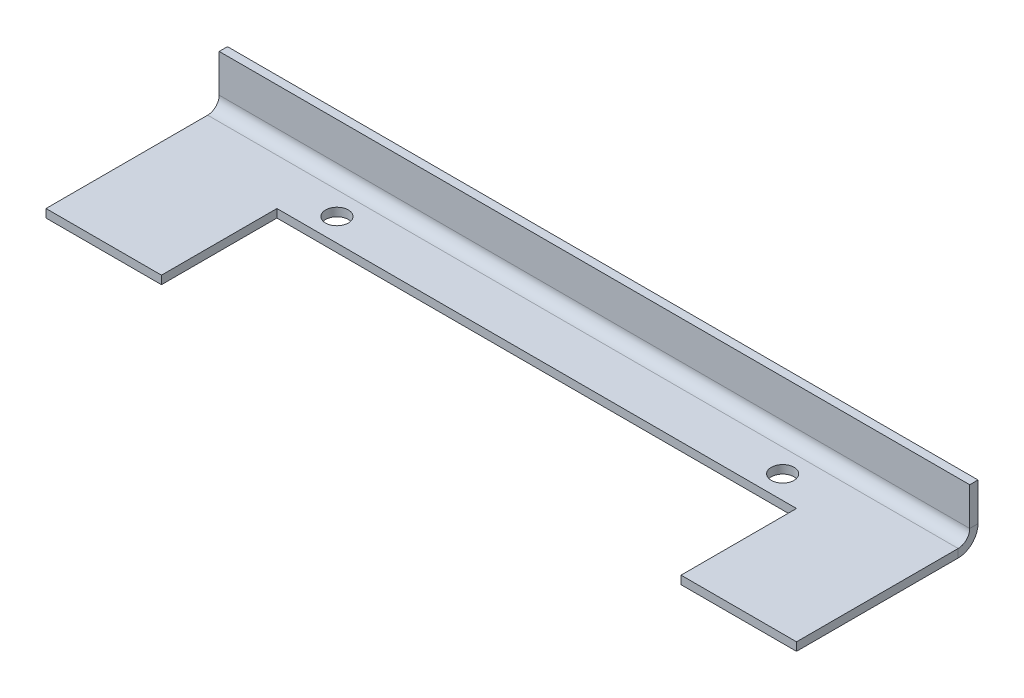
ISO-10303-21;
HEADER;
FILE_DESCRIPTION(('STEP AP214'),'2;1');
FILE_NAME('part.step','',(''),(''),'','','');
FILE_SCHEMA(('AUTOMOTIVE_DESIGN { 1 0 10303 214 1 1 1 1 }'));
ENDSEC;
DATA;
#1=APPLICATION_CONTEXT('core data for automotive mechanical design processes');
#2=APPLICATION_PROTOCOL_DEFINITION('international standard','automotive_design',2000,#1);
#3=PRODUCT_CONTEXT('',#1,'mechanical');
#4=PRODUCT('Part','Part','',(#3));
#5=PRODUCT_RELATED_PRODUCT_CATEGORY('part','',(#4));
#6=PRODUCT_DEFINITION_FORMATION('','',#4);
#7=PRODUCT_DEFINITION_CONTEXT('part definition',#1,'design');
#8=PRODUCT_DEFINITION('design','',#6,#7);
#9=PRODUCT_DEFINITION_SHAPE('','',#8);
#10=(LENGTH_UNIT() NAMED_UNIT(*) SI_UNIT(.MILLI.,.METRE.));
#11=(NAMED_UNIT(*) PLANE_ANGLE_UNIT() SI_UNIT($,.RADIAN.));
#12=(NAMED_UNIT(*) SI_UNIT($,.STERADIAN.) SOLID_ANGLE_UNIT());
#13=UNCERTAINTY_MEASURE_WITH_UNIT(LENGTH_MEASURE(1.E-05),#10,'distance_accuracy_value','');
#14=(GEOMETRIC_REPRESENTATION_CONTEXT(3) GLOBAL_UNCERTAINTY_ASSIGNED_CONTEXT((#13)) GLOBAL_UNIT_ASSIGNED_CONTEXT((#10,
#11,#12)) REPRESENTATION_CONTEXT('',''));
#15=CARTESIAN_POINT('',(0.,0.,0.));
#16=DIRECTION('',(0.,0.,1.));
#17=DIRECTION('',(1.,0.,0.));
#18=AXIS2_PLACEMENT_3D('',#15,#16,#17);
#19=CARTESIAN_POINT('',(0.,-0.91186,0.));
#20=DIRECTION('',(-1.,0.,0.));
#21=DIRECTION('',(0.,0.,1.));
#22=AXIS2_PLACEMENT_3D('',#19,#20,#21);
#23=PLANE('',#22);
#24=DIRECTION('',(0.,0.,1.));
#25=VECTOR('',#24,1.);
#26=CARTESIAN_POINT('',(0.,0.,0.));
#27=LINE('',#26,#25);
#28=CARTESIAN_POINT('',(0.,0.,1.27));
#29=VERTEX_POINT('',#28);
#30=CARTESIAN_POINT('',(0.,0.,19.05));
#31=VERTEX_POINT('',#30);
#32=EDGE_CURVE('E140',#29,#31,#27,.T.);
#33=ORIENTED_EDGE('',*,*,#32,.F.);
#34=DIRECTION('',(0.,-1.,0.));
#35=VECTOR('',#34,1.);
#36=CARTESIAN_POINT('',(0.,0.,1.27));
#37=LINE('',#36,#35);
#38=CARTESIAN_POINT('',(0.,-0.911860000000013,1.27));
#39=VERTEX_POINT('',#38);
#40=EDGE_CURVE('E191',#29,#39,#37,.T.);
#41=ORIENTED_EDGE('',*,*,#40,.T.);
#42=DIRECTION('',(0.,0.,1.));
#43=VECTOR('',#42,1.);
#44=CARTESIAN_POINT('',(0.,-0.91186,0.));
#45=LINE('',#44,#43);
#46=CARTESIAN_POINT('',(0.,-0.91186,19.05));
#47=VERTEX_POINT('',#46);
#48=EDGE_CURVE('E94',#39,#47,#45,.T.);
#49=ORIENTED_EDGE('',*,*,#48,.T.);
#50=DIRECTION('',(0.,1.,0.));
#51=VECTOR('',#50,1.);
#52=CARTESIAN_POINT('',(0.,-0.91186,19.05));
#53=LINE('',#52,#51);
#54=EDGE_CURVE('E40',#47,#31,#53,.T.);
#55=ORIENTED_EDGE('',*,*,#54,.T.);
#56=EDGE_LOOP('',(#33,#41,#49,#55));
#57=FACE_BOUND('',#56,.T.);
#58=ADVANCED_FACE('F36',(#57),#23,.T.);
#59=CARTESIAN_POINT('',(0.,-0.91186,0.));
#60=DIRECTION('',(0.,-1.,0.));
#61=DIRECTION('',(0.,0.,-1.));
#62=AXIS2_PLACEMENT_3D('',#59,#60,#61);
#63=PLANE('',#62);
#64=CARTESIAN_POINT('',(65.786,-0.91186,3.81));
#65=DIRECTION('',(0.,-1.,0.));
#66=DIRECTION('',(0.,0.,-1.));
#67=AXIS2_PLACEMENT_3D('',#64,#65,#66);
#68=CIRCLE('',#67,1.25);
#69=CARTESIAN_POINT('',(65.786,-0.91186,2.56));
#70=VERTEX_POINT('',#69);
#71=EDGE_CURVE('E190',#70,#70,#68,.T.);
#72=ORIENTED_EDGE('',*,*,#71,.F.);
#73=EDGE_LOOP('',(#72));
#74=FACE_BOUND('',#73,.T.);
#75=CARTESIAN_POINT('',(16.764,-0.91186,3.81));
#76=DIRECTION('',(0.,-1.,0.));
#77=DIRECTION('',(0.,0.,-1.));
#78=AXIS2_PLACEMENT_3D('',#75,#76,#77);
#79=CIRCLE('',#78,1.25);
#80=CARTESIAN_POINT('',(16.764,-0.91186,2.56));
#81=VERTEX_POINT('',#80);
#82=EDGE_CURVE('E198',#81,#81,#79,.T.);
#83=ORIENTED_EDGE('',*,*,#82,.F.);
#84=EDGE_LOOP('',(#83));
#85=FACE_BOUND('',#84,.T.);
#86=ORIENTED_EDGE('',*,*,#48,.F.);
#87=DIRECTION('',(-1.,0.,0.));
#88=VECTOR('',#87,1.);
#89=CARTESIAN_POINT('',(0.,-0.911860000000013,1.27));
#90=LINE('',#89,#88);
#91=CARTESIAN_POINT('',(82.55,-0.91186,1.27));
#92=VERTEX_POINT('',#91);
#93=EDGE_CURVE('E469',#39,#92,#90,.F.);
#94=ORIENTED_EDGE('',*,*,#93,.T.);
#95=DIRECTION('',(0.,0.,-1.));
#96=VECTOR('',#95,1.);
#97=CARTESIAN_POINT('',(82.55,-0.91186,0.));
#98=LINE('',#97,#96);
#99=CARTESIAN_POINT('',(82.55,-0.91186,19.05));
#100=VERTEX_POINT('',#99);
#101=EDGE_CURVE('E154',#100,#92,#98,.T.);
#102=ORIENTED_EDGE('',*,*,#101,.F.);
#103=DIRECTION('',(1.,0.,0.));
#104=VECTOR('',#103,1.);
#105=CARTESIAN_POINT('',(82.55,-0.91186,19.05));
#106=LINE('',#105,#104);
#107=CARTESIAN_POINT('',(69.85,-0.91186,19.05));
#108=VERTEX_POINT('',#107);
#109=EDGE_CURVE('E127',#108,#100,#106,.T.);
#110=ORIENTED_EDGE('',*,*,#109,.F.);
#111=DIRECTION('',(0.,0.,1.));
#112=VECTOR('',#111,1.);
#113=CARTESIAN_POINT('',(69.85,-0.91186,6.35));
#114=LINE('',#113,#112);
#115=CARTESIAN_POINT('',(69.85,-0.91186,6.35));
#116=VERTEX_POINT('',#115);
#117=EDGE_CURVE('E111',#116,#108,#114,.T.);
#118=ORIENTED_EDGE('',*,*,#117,.F.);
#119=DIRECTION('',(1.,0.,0.));
#120=VECTOR('',#119,1.);
#121=CARTESIAN_POINT('',(12.7,-0.91186,6.35));
#122=LINE('',#121,#120);
#123=CARTESIAN_POINT('',(12.7,-0.91186,6.35));
#124=VERTEX_POINT('',#123);
#125=EDGE_CURVE('E125',#124,#116,#122,.T.);
#126=ORIENTED_EDGE('',*,*,#125,.F.);
#127=DIRECTION('',(0.,0.,-1.));
#128=VECTOR('',#127,1.);
#129=CARTESIAN_POINT('',(12.7,-0.91186,6.35));
#130=LINE('',#129,#128);
#131=CARTESIAN_POINT('',(12.7,-0.91186,19.05));
#132=VERTEX_POINT('',#131);
#133=EDGE_CURVE('E130',#132,#124,#130,.T.);
#134=ORIENTED_EDGE('',*,*,#133,.F.);
#135=DIRECTION('',(1.,0.,0.));
#136=VECTOR('',#135,1.);
#137=CARTESIAN_POINT('',(0.,-0.91186,19.05));
#138=LINE('',#137,#136);
#139=EDGE_CURVE('E132',#47,#132,#138,.T.);
#140=ORIENTED_EDGE('',*,*,#139,.F.);
#141=EDGE_LOOP('',(#86,#94,#102,#110,#118,#126,#134,#140));
#142=FACE_BOUND('',#141,.T.);
#143=ADVANCED_FACE('F123',(#74,#85,#142),#63,.T.);
#144=CARTESIAN_POINT('',(0.,0.,0.));
#145=DIRECTION('',(0.,-1.,0.));
#146=DIRECTION('',(0.,0.,-1.));
#147=AXIS2_PLACEMENT_3D('',#144,#145,#146);
#148=PLANE('',#147);
#149=CARTESIAN_POINT('',(16.764,0.,3.81));
#150=DIRECTION('',(0.,-1.,0.));
#151=DIRECTION('',(0.,0.,-1.));
#152=AXIS2_PLACEMENT_3D('',#149,#150,#151);
#153=CIRCLE('',#152,1.25);
#154=CARTESIAN_POINT('',(16.764,0.,2.56));
#155=VERTEX_POINT('',#154);
#156=EDGE_CURVE('E141',#155,#155,#153,.T.);
#157=ORIENTED_EDGE('',*,*,#156,.T.);
#158=EDGE_LOOP('',(#157));
#159=FACE_BOUND('',#158,.T.);
#160=CARTESIAN_POINT('',(65.786,0.,3.81));
#161=DIRECTION('',(0.,-1.,0.));
#162=DIRECTION('',(0.,0.,-1.));
#163=AXIS2_PLACEMENT_3D('',#160,#161,#162);
#164=CIRCLE('',#163,1.25);
#165=CARTESIAN_POINT('',(65.786,0.,2.56));
#166=VERTEX_POINT('',#165);
#167=EDGE_CURVE('E195',#166,#166,#164,.T.);
#168=ORIENTED_EDGE('',*,*,#167,.T.);
#169=EDGE_LOOP('',(#168));
#170=FACE_BOUND('',#169,.T.);
#171=DIRECTION('',(-1.,0.,0.));
#172=VECTOR('',#171,1.);
#173=CARTESIAN_POINT('',(0.,0.,1.27));
#174=LINE('',#173,#172);
#175=CARTESIAN_POINT('',(82.55,0.,1.27));
#176=VERTEX_POINT('',#175);
#177=EDGE_CURVE('E170',#29,#176,#174,.F.);
#178=ORIENTED_EDGE('',*,*,#177,.F.);
#179=ORIENTED_EDGE('',*,*,#32,.T.);
#180=DIRECTION('',(1.,0.,0.));
#181=VECTOR('',#180,1.);
#182=CARTESIAN_POINT('',(0.,0.,19.05));
#183=LINE('',#182,#181);
#184=CARTESIAN_POINT('',(12.7,0.,19.05));
#185=VERTEX_POINT('',#184);
#186=EDGE_CURVE('E143',#31,#185,#183,.T.);
#187=ORIENTED_EDGE('',*,*,#186,.T.);
#188=DIRECTION('',(0.,0.,-1.));
#189=VECTOR('',#188,1.);
#190=CARTESIAN_POINT('',(12.7,0.,6.35));
#191=LINE('',#190,#189);
#192=CARTESIAN_POINT('',(12.7,0.,6.35));
#193=VERTEX_POINT('',#192);
#194=EDGE_CURVE('E146',#185,#193,#191,.T.);
#195=ORIENTED_EDGE('',*,*,#194,.T.);
#196=DIRECTION('',(1.,0.,0.));
#197=VECTOR('',#196,1.);
#198=CARTESIAN_POINT('',(12.7,0.,6.35));
#199=LINE('',#198,#197);
#200=CARTESIAN_POINT('',(69.85,0.,6.35));
#201=VERTEX_POINT('',#200);
#202=EDGE_CURVE('E149',#193,#201,#199,.T.);
#203=ORIENTED_EDGE('',*,*,#202,.T.);
#204=DIRECTION('',(0.,0.,1.));
#205=VECTOR('',#204,1.);
#206=CARTESIAN_POINT('',(69.85,0.,6.35));
#207=LINE('',#206,#205);
#208=CARTESIAN_POINT('',(69.85,0.,19.05));
#209=VERTEX_POINT('',#208);
#210=EDGE_CURVE('E114',#201,#209,#207,.T.);
#211=ORIENTED_EDGE('',*,*,#210,.T.);
#212=DIRECTION('',(1.,0.,0.));
#213=VECTOR('',#212,1.);
#214=CARTESIAN_POINT('',(82.55,0.,19.05));
#215=LINE('',#214,#213);
#216=CARTESIAN_POINT('',(82.55,0.,19.05));
#217=VERTEX_POINT('',#216);
#218=EDGE_CURVE('E152',#209,#217,#215,.T.);
#219=ORIENTED_EDGE('',*,*,#218,.T.);
#220=DIRECTION('',(0.,0.,-1.));
#221=VECTOR('',#220,1.);
#222=CARTESIAN_POINT('',(82.55,0.,0.));
#223=LINE('',#222,#221);
#224=EDGE_CURVE('E137',#217,#176,#223,.T.);
#225=ORIENTED_EDGE('',*,*,#224,.T.);
#226=EDGE_LOOP('',(#178,#179,#187,#195,#203,#211,#219,#225));
#227=FACE_BOUND('',#226,.T.);
#228=ADVANCED_FACE('F168',(#159,#170,#227),#148,.F.);
#229=CARTESIAN_POINT('',(82.55,-0.91186,0.));
#230=DIRECTION('',(1.,0.,0.));
#231=DIRECTION('',(0.,0.,-1.));
#232=AXIS2_PLACEMENT_3D('',#229,#230,#231);
#233=PLANE('',#232);
#234=DIRECTION('',(0.,-1.,0.));
#235=VECTOR('',#234,1.);
#236=CARTESIAN_POINT('',(82.55,0.,1.27));
#237=LINE('',#236,#235);
#238=EDGE_CURVE('E188',#176,#92,#237,.T.);
#239=ORIENTED_EDGE('',*,*,#238,.F.);
#240=ORIENTED_EDGE('',*,*,#224,.F.);
#241=DIRECTION('',(0.,1.,0.));
#242=VECTOR('',#241,1.);
#243=CARTESIAN_POINT('',(82.55,-0.91186,19.05));
#244=LINE('',#243,#242);
#245=EDGE_CURVE('E11',#100,#217,#244,.T.);
#246=ORIENTED_EDGE('',*,*,#245,.F.);
#247=ORIENTED_EDGE('',*,*,#101,.T.);
#248=EDGE_LOOP('',(#239,#240,#246,#247));
#249=FACE_BOUND('',#248,.T.);
#250=ADVANCED_FACE('F38',(#249),#233,.T.);
#251=CARTESIAN_POINT('',(82.55,-0.91186,19.05));
#252=DIRECTION('',(0.,0.,1.));
#253=DIRECTION('',(1.,0.,0.));
#254=AXIS2_PLACEMENT_3D('',#251,#252,#253);
#255=PLANE('',#254);
#256=ORIENTED_EDGE('',*,*,#218,.F.);
#257=DIRECTION('',(0.,1.,0.));
#258=VECTOR('',#257,1.);
#259=CARTESIAN_POINT('',(69.85,-0.91186,19.05));
#260=LINE('',#259,#258);
#261=EDGE_CURVE('E45',#108,#209,#260,.T.);
#262=ORIENTED_EDGE('',*,*,#261,.F.);
#263=ORIENTED_EDGE('',*,*,#109,.T.);
#264=ORIENTED_EDGE('',*,*,#245,.T.);
#265=EDGE_LOOP('',(#256,#262,#263,#264));
#266=FACE_BOUND('',#265,.T.);
#267=ADVANCED_FACE('F207',(#266),#255,.T.);
#268=CARTESIAN_POINT('',(69.85,-0.91186,6.35));
#269=DIRECTION('',(-1.,0.,0.));
#270=DIRECTION('',(0.,0.,1.));
#271=AXIS2_PLACEMENT_3D('',#268,#269,#270);
#272=PLANE('',#271);
#273=ORIENTED_EDGE('',*,*,#210,.F.);
#274=DIRECTION('',(0.,1.,0.));
#275=VECTOR('',#274,1.);
#276=CARTESIAN_POINT('',(69.85,-0.91186,6.35));
#277=LINE('',#276,#275);
#278=EDGE_CURVE('E108',#116,#201,#277,.T.);
#279=ORIENTED_EDGE('',*,*,#278,.F.);
#280=ORIENTED_EDGE('',*,*,#117,.T.);
#281=ORIENTED_EDGE('',*,*,#261,.T.);
#282=EDGE_LOOP('',(#273,#279,#280,#281));
#283=FACE_BOUND('',#282,.T.);
#284=ADVANCED_FACE('F110',(#283),#272,.T.);
#285=CARTESIAN_POINT('',(12.7,-0.91186,6.35));
#286=DIRECTION('',(0.,0.,1.));
#287=DIRECTION('',(1.,0.,0.));
#288=AXIS2_PLACEMENT_3D('',#285,#286,#287);
#289=PLANE('',#288);
#290=ORIENTED_EDGE('',*,*,#202,.F.);
#291=DIRECTION('',(0.,1.,0.));
#292=VECTOR('',#291,1.);
#293=CARTESIAN_POINT('',(12.7,-0.91186,6.35));
#294=LINE('',#293,#292);
#295=EDGE_CURVE('E119',#124,#193,#294,.T.);
#296=ORIENTED_EDGE('',*,*,#295,.F.);
#297=ORIENTED_EDGE('',*,*,#125,.T.);
#298=ORIENTED_EDGE('',*,*,#278,.T.);
#299=EDGE_LOOP('',(#290,#296,#297,#298));
#300=FACE_BOUND('',#299,.T.);
#301=ADVANCED_FACE('F129',(#300),#289,.T.);
#302=CARTESIAN_POINT('',(12.7,-0.91186,6.35));
#303=DIRECTION('',(1.,0.,0.));
#304=DIRECTION('',(0.,0.,-1.));
#305=AXIS2_PLACEMENT_3D('',#302,#303,#304);
#306=PLANE('',#305);
#307=ORIENTED_EDGE('',*,*,#194,.F.);
#308=DIRECTION('',(0.,1.,0.));
#309=VECTOR('',#308,1.);
#310=CARTESIAN_POINT('',(12.7,-0.91186,19.05));
#311=LINE('',#310,#309);
#312=EDGE_CURVE('E157',#132,#185,#311,.T.);
#313=ORIENTED_EDGE('',*,*,#312,.F.);
#314=ORIENTED_EDGE('',*,*,#133,.T.);
#315=ORIENTED_EDGE('',*,*,#295,.T.);
#316=EDGE_LOOP('',(#307,#313,#314,#315));
#317=FACE_BOUND('',#316,.T.);
#318=ADVANCED_FACE('F206',(#317),#306,.T.);
#319=CARTESIAN_POINT('',(0.,-0.91186,19.05));
#320=DIRECTION('',(0.,0.,1.));
#321=DIRECTION('',(1.,0.,0.));
#322=AXIS2_PLACEMENT_3D('',#319,#320,#321);
#323=PLANE('',#322);
#324=ORIENTED_EDGE('',*,*,#186,.F.);
#325=ORIENTED_EDGE('',*,*,#54,.F.);
#326=ORIENTED_EDGE('',*,*,#139,.T.);
#327=ORIENTED_EDGE('',*,*,#312,.T.);
#328=EDGE_LOOP('',(#324,#325,#326,#327));
#329=FACE_BOUND('',#328,.T.);
#330=ADVANCED_FACE('F165',(#329),#323,.T.);
#331=CARTESIAN_POINT('',(16.764,-0.91186,3.81));
#332=DIRECTION('',(0.,-1.,0.));
#333=DIRECTION('',(0.,0.,-1.));
#334=AXIS2_PLACEMENT_3D('',#331,#332,#333);
#335=CYLINDRICAL_SURFACE('',#334,1.25);
#336=ORIENTED_EDGE('',*,*,#156,.F.);
#337=EDGE_LOOP('',(#336));
#338=FACE_BOUND('',#337,.T.);
#339=ORIENTED_EDGE('',*,*,#82,.T.);
#340=EDGE_LOOP('',(#339));
#341=FACE_BOUND('',#340,.T.);
#342=ADVANCED_FACE('F225',(#338,#341),#335,.F.);
#343=CARTESIAN_POINT('',(65.786,-0.91186,3.81));
#344=DIRECTION('',(0.,-1.,0.));
#345=DIRECTION('',(0.,0.,-1.));
#346=AXIS2_PLACEMENT_3D('',#343,#344,#345);
#347=CYLINDRICAL_SURFACE('',#346,1.25);
#348=ORIENTED_EDGE('',*,*,#167,.F.);
#349=EDGE_LOOP('',(#348));
#350=FACE_BOUND('',#349,.T.);
#351=ORIENTED_EDGE('',*,*,#71,.T.);
#352=EDGE_LOOP('',(#351));
#353=FACE_BOUND('',#352,.T.);
#354=ADVANCED_FACE('F247',(#350,#353),#347,.F.);
#355=CARTESIAN_POINT('',(82.55,1.26999999999999,1.27));
#356=DIRECTION('',(1.,0.,0.));
#357=DIRECTION('',(0.,0.,-1.));
#358=AXIS2_PLACEMENT_3D('',#355,#356,#357);
#359=PLANE('',#358);
#360=DIRECTION('',(0.,0.,-1.));
#361=VECTOR('',#360,1.);
#362=CARTESIAN_POINT('',(82.55,1.27,0.));
#363=LINE('',#362,#361);
#364=CARTESIAN_POINT('',(82.55,1.26999999999998,0.));
#365=VERTEX_POINT('',#364);
#366=CARTESIAN_POINT('',(82.55,1.26999999999998,-0.911860000000004));
#367=VERTEX_POINT('',#366);
#368=EDGE_CURVE('E491',#365,#367,#363,.T.);
#369=ORIENTED_EDGE('',*,*,#368,.F.);
#370=CARTESIAN_POINT('',(82.55,1.26999999999999,1.27));
#371=DIRECTION('',(-1.,0.,0.));
#372=DIRECTION('',(0.,0.,1.));
#373=AXIS2_PLACEMENT_3D('',#370,#371,#372);
#374=CIRCLE('',#373,1.27);
#375=EDGE_CURVE('E179',#176,#365,#374,.F.);
#376=ORIENTED_EDGE('',*,*,#375,.F.);
#377=ORIENTED_EDGE('',*,*,#238,.T.);
#378=CARTESIAN_POINT('',(82.55,1.26999999999999,1.27));
#379=DIRECTION('',(-1.,0.,0.));
#380=DIRECTION('',(0.,0.,1.));
#381=AXIS2_PLACEMENT_3D('',#378,#379,#380);
#382=CIRCLE('',#381,2.18186);
#383=EDGE_CURVE('E53',#92,#367,#382,.F.);
#384=ORIENTED_EDGE('',*,*,#383,.T.);
#385=EDGE_LOOP('',(#369,#376,#377,#384));
#386=FACE_BOUND('',#385,.T.);
#387=ADVANCED_FACE('F255',(#386),#359,.T.);
#388=CARTESIAN_POINT('',(0.,1.26999999999999,1.27));
#389=DIRECTION('',(1.,0.,0.));
#390=DIRECTION('',(0.,0.,-1.));
#391=AXIS2_PLACEMENT_3D('',#388,#389,#390);
#392=PLANE('',#391);
#393=CARTESIAN_POINT('',(0.,1.26999999999999,1.27));
#394=DIRECTION('',(-1.,0.,0.));
#395=DIRECTION('',(0.,0.,1.));
#396=AXIS2_PLACEMENT_3D('',#393,#394,#395);
#397=CIRCLE('',#396,1.27);
#398=CARTESIAN_POINT('',(0.,1.26999999999998,0.));
#399=VERTEX_POINT('',#398);
#400=EDGE_CURVE('E180',#399,#29,#397,.T.);
#401=ORIENTED_EDGE('',*,*,#400,.F.);
#402=DIRECTION('',(0.,0.,-1.));
#403=VECTOR('',#402,1.);
#404=CARTESIAN_POINT('',(0.,1.27,0.));
#405=LINE('',#404,#403);
#406=CARTESIAN_POINT('',(0.,1.27,-0.911860000000004));
#407=VERTEX_POINT('',#406);
#408=EDGE_CURVE('E477',#399,#407,#405,.T.);
#409=ORIENTED_EDGE('',*,*,#408,.T.);
#410=CARTESIAN_POINT('',(0.,1.26999999999999,1.27));
#411=DIRECTION('',(-1.,0.,0.));
#412=DIRECTION('',(0.,0.,1.));
#413=AXIS2_PLACEMENT_3D('',#410,#411,#412);
#414=CIRCLE('',#413,2.18186);
#415=EDGE_CURVE('E182',#407,#39,#414,.T.);
#416=ORIENTED_EDGE('',*,*,#415,.T.);
#417=ORIENTED_EDGE('',*,*,#40,.F.);
#418=EDGE_LOOP('',(#401,#409,#416,#417));
#419=FACE_BOUND('',#418,.T.);
#420=ADVANCED_FACE('F263',(#419),#392,.F.);
#421=CARTESIAN_POINT('',(0.,1.26999999999999,1.27));
#422=DIRECTION('',(-1.,0.,0.));
#423=DIRECTION('',(0.,0.,-1.));
#424=AXIS2_PLACEMENT_3D('',#421,#422,#423);
#425=CYLINDRICAL_SURFACE('',#424,2.18186);
#426=ORIENTED_EDGE('',*,*,#93,.F.);
#427=ORIENTED_EDGE('',*,*,#415,.F.);
#428=DIRECTION('',(1.,0.,0.));
#429=VECTOR('',#428,1.);
#430=CARTESIAN_POINT('',(0.,1.27,-0.911860000000004));
#431=LINE('',#430,#429);
#432=EDGE_CURVE('E481',#407,#367,#431,.T.);
#433=ORIENTED_EDGE('',*,*,#432,.T.);
#434=ORIENTED_EDGE('',*,*,#383,.F.);
#435=EDGE_LOOP('',(#426,#427,#433,#434));
#436=FACE_BOUND('',#435,.T.);
#437=ADVANCED_FACE('F272',(#436),#425,.T.);
#438=CARTESIAN_POINT('',(0.,1.26999999999999,1.27));
#439=DIRECTION('',(-1.,0.,0.));
#440=DIRECTION('',(0.,0.,-1.));
#441=AXIS2_PLACEMENT_3D('',#438,#439,#440);
#442=CYLINDRICAL_SURFACE('',#441,1.27);
#443=ORIENTED_EDGE('',*,*,#177,.T.);
#444=ORIENTED_EDGE('',*,*,#375,.T.);
#445=DIRECTION('',(-1.,0.,0.));
#446=VECTOR('',#445,1.);
#447=CARTESIAN_POINT('',(82.55,1.27,0.));
#448=LINE('',#447,#446);
#449=EDGE_CURVE('E460',#365,#399,#448,.T.);
#450=ORIENTED_EDGE('',*,*,#449,.T.);
#451=ORIENTED_EDGE('',*,*,#400,.T.);
#452=EDGE_LOOP('',(#443,#444,#450,#451));
#453=FACE_BOUND('',#452,.T.);
#454=ADVANCED_FACE('F280',(#453),#442,.F.);
#455=CARTESIAN_POINT('',(0.,5.43814,-0.911860000000019));
#456=DIRECTION('',(1.,0.,0.));
#457=DIRECTION('',(0.,0.,-1.));
#458=AXIS2_PLACEMENT_3D('',#455,#456,#457);
#459=PLANE('',#458);
#460=ORIENTED_EDGE('',*,*,#408,.F.);
#461=DIRECTION('',(0.,1.,0.));
#462=VECTOR('',#461,1.);
#463=CARTESIAN_POINT('',(0.,5.43814,0.));
#464=LINE('',#463,#462);
#465=CARTESIAN_POINT('',(0.,5.43814,0.));
#466=VERTEX_POINT('',#465);
#467=EDGE_CURVE('E450',#399,#466,#464,.T.);
#468=ORIENTED_EDGE('',*,*,#467,.T.);
#469=DIRECTION('',(0.,0.,1.));
#470=VECTOR('',#469,1.);
#471=CARTESIAN_POINT('',(0.,5.43814,-0.911860000000019));
#472=LINE('',#471,#470);
#473=CARTESIAN_POINT('',(0.,5.43814,-0.911860000000019));
#474=VERTEX_POINT('',#473);
#475=EDGE_CURVE('E184',#474,#466,#472,.T.);
#476=ORIENTED_EDGE('',*,*,#475,.F.);
#477=DIRECTION('',(0.,1.,0.));
#478=VECTOR('',#477,1.);
#479=CARTESIAN_POINT('',(0.,5.43814,-0.911860000000019));
#480=LINE('',#479,#478);
#481=EDGE_CURVE('E461',#407,#474,#480,.T.);
#482=ORIENTED_EDGE('',*,*,#481,.F.);
#483=EDGE_LOOP('',(#460,#468,#476,#482));
#484=FACE_BOUND('',#483,.T.);
#485=ADVANCED_FACE('F287',(#484),#459,.F.);
#486=CARTESIAN_POINT('',(82.55,0.,-0.91186));
#487=DIRECTION('',(-1.,0.,0.));
#488=DIRECTION('',(0.,0.,1.));
#489=AXIS2_PLACEMENT_3D('',#486,#487,#488);
#490=PLANE('',#489);
#491=ORIENTED_EDGE('',*,*,#368,.T.);
#492=DIRECTION('',(0.,-1.,0.));
#493=VECTOR('',#492,1.);
#494=CARTESIAN_POINT('',(82.55,0.,-0.91186));
#495=LINE('',#494,#493);
#496=CARTESIAN_POINT('',(82.55,5.43814,-0.911860000000019));
#497=VERTEX_POINT('',#496);
#498=EDGE_CURVE('E456',#497,#367,#495,.T.);
#499=ORIENTED_EDGE('',*,*,#498,.F.);
#500=DIRECTION('',(0.,0.,1.));
#501=VECTOR('',#500,1.);
#502=CARTESIAN_POINT('',(82.55,5.43814,-0.911860000000019));
#503=LINE('',#502,#501);
#504=CARTESIAN_POINT('',(82.55,5.43814,0.));
#505=VERTEX_POINT('',#504);
#506=EDGE_CURVE('E441',#497,#505,#503,.T.);
#507=ORIENTED_EDGE('',*,*,#506,.T.);
#508=DIRECTION('',(0.,-1.,0.));
#509=VECTOR('',#508,1.);
#510=CARTESIAN_POINT('',(82.55,0.,0.));
#511=LINE('',#510,#509);
#512=EDGE_CURVE('E449',#505,#365,#511,.T.);
#513=ORIENTED_EDGE('',*,*,#512,.T.);
#514=EDGE_LOOP('',(#491,#499,#507,#513));
#515=FACE_BOUND('',#514,.T.);
#516=ADVANCED_FACE('F294',(#515),#490,.F.);
#517=CARTESIAN_POINT('',(0.,0.,-0.91186));
#518=DIRECTION('',(0.,0.,1.));
#519=DIRECTION('',(0.,-1.,0.));
#520=AXIS2_PLACEMENT_3D('',#517,#518,#519);
#521=PLANE('',#520);
#522=ORIENTED_EDGE('',*,*,#432,.F.);
#523=ORIENTED_EDGE('',*,*,#481,.T.);
#524=DIRECTION('',(1.,0.,0.));
#525=VECTOR('',#524,1.);
#526=CARTESIAN_POINT('',(82.55,5.43814,-0.911860000000019));
#527=LINE('',#526,#525);
#528=EDGE_CURVE('E464',#474,#497,#527,.T.);
#529=ORIENTED_EDGE('',*,*,#528,.T.);
#530=ORIENTED_EDGE('',*,*,#498,.T.);
#531=EDGE_LOOP('',(#522,#523,#529,#530));
#532=FACE_BOUND('',#531,.T.);
#533=ADVANCED_FACE('F302',(#532),#521,.F.);
#534=CARTESIAN_POINT('',(0.,0.,0.));
#535=DIRECTION('',(0.,0.,1.));
#536=DIRECTION('',(0.,-1.,0.));
#537=AXIS2_PLACEMENT_3D('',#534,#535,#536);
#538=PLANE('',#537);
#539=ORIENTED_EDGE('',*,*,#467,.F.);
#540=ORIENTED_EDGE('',*,*,#449,.F.);
#541=ORIENTED_EDGE('',*,*,#512,.F.);
#542=DIRECTION('',(1.,0.,0.));
#543=VECTOR('',#542,1.);
#544=CARTESIAN_POINT('',(82.55,5.43814,0.));
#545=LINE('',#544,#543);
#546=EDGE_CURVE('E437',#466,#505,#545,.T.);
#547=ORIENTED_EDGE('',*,*,#546,.F.);
#548=EDGE_LOOP('',(#539,#540,#541,#547));
#549=FACE_BOUND('',#548,.T.);
#550=ADVANCED_FACE('F310',(#549),#538,.T.);
#551=CARTESIAN_POINT('',(82.55,5.43814,-0.911860000000019));
#552=DIRECTION('',(0.,-1.,0.));
#553=DIRECTION('',(0.,0.,-1.));
#554=AXIS2_PLACEMENT_3D('',#551,#552,#553);
#555=PLANE('',#554);
#556=ORIENTED_EDGE('',*,*,#546,.T.);
#557=ORIENTED_EDGE('',*,*,#506,.F.);
#558=ORIENTED_EDGE('',*,*,#528,.F.);
#559=ORIENTED_EDGE('',*,*,#475,.T.);
#560=EDGE_LOOP('',(#556,#557,#558,#559));
#561=FACE_BOUND('',#560,.T.);
#562=ADVANCED_FACE('F318',(#561),#555,.F.);
#563=CLOSED_SHELL('',(#58,#143,#228,#250,#267,#284,#301,#318,#330,#342,#354,#387,#420,#437,#454,
#485,#516,#533,#550,#562));
#564=MANIFOLD_SOLID_BREP('B2',#563);
#565=ADVANCED_BREP_SHAPE_REPRESENTATION('',(#18,#564),#14);
#566=SHAPE_DEFINITION_REPRESENTATION(#9,#565);
ENDSEC;
END-ISO-10303-21;
